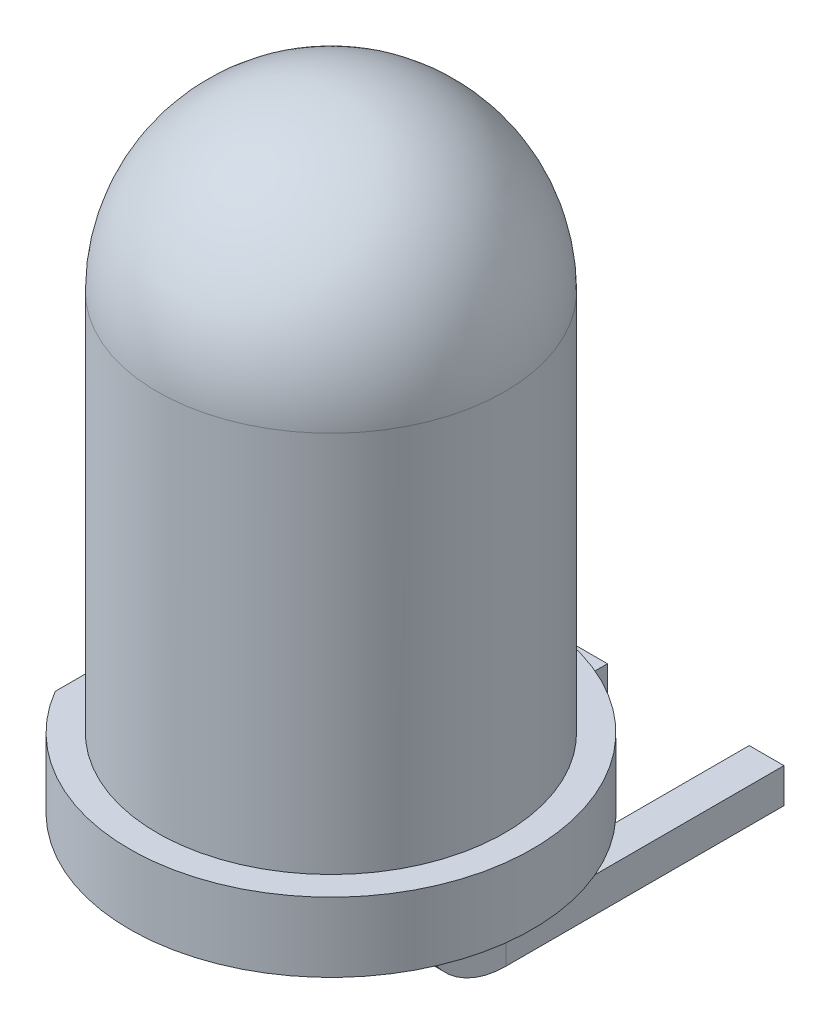
ISO-10303-21;
HEADER;
FILE_DESCRIPTION(('STEP AP214'),'2;1');
FILE_NAME('part.step','',(''),(''),'','','');
FILE_SCHEMA(('AUTOMOTIVE_DESIGN { 1 0 10303 214 1 1 1 1 }'));
ENDSEC;
DATA;
#1=APPLICATION_CONTEXT('core data for automotive mechanical design processes');
#2=APPLICATION_PROTOCOL_DEFINITION('international standard','automotive_design',2000,#1);
#3=PRODUCT_CONTEXT('',#1,'mechanical');
#4=PRODUCT('Part','Part','',(#3));
#5=PRODUCT_RELATED_PRODUCT_CATEGORY('part','',(#4));
#6=PRODUCT_DEFINITION_FORMATION('','',#4);
#7=PRODUCT_DEFINITION_CONTEXT('part definition',#1,'design');
#8=PRODUCT_DEFINITION('design','',#6,#7);
#9=PRODUCT_DEFINITION_SHAPE('','',#8);
#10=(LENGTH_UNIT() NAMED_UNIT(*) SI_UNIT(.MILLI.,.METRE.));
#11=(NAMED_UNIT(*) PLANE_ANGLE_UNIT() SI_UNIT($,.RADIAN.));
#12=(NAMED_UNIT(*) SI_UNIT($,.STERADIAN.) SOLID_ANGLE_UNIT());
#13=UNCERTAINTY_MEASURE_WITH_UNIT(LENGTH_MEASURE(1.E-05),#10,'distance_accuracy_value','');
#14=(GEOMETRIC_REPRESENTATION_CONTEXT(3) GLOBAL_UNCERTAINTY_ASSIGNED_CONTEXT((#13)) GLOBAL_UNIT_ASSIGNED_CONTEXT((#10,
#11,#12)) REPRESENTATION_CONTEXT('',''));
#15=CARTESIAN_POINT('',(0.,0.,0.));
#16=DIRECTION('',(0.,0.,1.));
#17=DIRECTION('',(1.,0.,0.));
#18=AXIS2_PLACEMENT_3D('',#15,#16,#17);
#19=CARTESIAN_POINT('',(2.9,0.,0.));
#20=DIRECTION('',(0.,1.,0.));
#21=DIRECTION('',(0.,0.,1.));
#22=AXIS2_PLACEMENT_3D('',#19,#20,#21);
#23=PLANE('',#22);
#24=DIRECTION('',(0.,0.,1.));
#25=VECTOR('',#24,1.);
#26=CARTESIAN_POINT('',(1.52,0.,-0.25));
#27=LINE('',#26,#25);
#28=CARTESIAN_POINT('',(1.52,0.,-0.25));
#29=VERTEX_POINT('',#28);
#30=CARTESIAN_POINT('',(1.52,0.,0.25));
#31=VERTEX_POINT('',#30);
#32=EDGE_CURVE('E185',#29,#31,#27,.T.);
#33=ORIENTED_EDGE('',*,*,#32,.F.);
#34=DIRECTION('',(1.,0.,0.));
#35=VECTOR('',#34,1.);
#36=CARTESIAN_POINT('',(1.02,0.,-0.25));
#37=LINE('',#36,#35);
#38=CARTESIAN_POINT('',(1.02,0.,-0.25));
#39=VERTEX_POINT('',#38);
#40=EDGE_CURVE('E178',#39,#29,#37,.T.);
#41=ORIENTED_EDGE('',*,*,#40,.F.);
#42=DIRECTION('',(0.,0.,-1.));
#43=VECTOR('',#42,1.);
#44=CARTESIAN_POINT('',(1.02,0.,-0.25));
#45=LINE('',#44,#43);
#46=CARTESIAN_POINT('',(1.02,0.,0.25));
#47=VERTEX_POINT('',#46);
#48=EDGE_CURVE('E165',#47,#39,#45,.T.);
#49=ORIENTED_EDGE('',*,*,#48,.F.);
#50=DIRECTION('',(-1.,0.,0.));
#51=VECTOR('',#50,1.);
#52=CARTESIAN_POINT('',(1.02,0.,0.25));
#53=LINE('',#52,#51);
#54=EDGE_CURVE('E172',#31,#47,#53,.T.);
#55=ORIENTED_EDGE('',*,*,#54,.F.);
#56=EDGE_LOOP('',(#33,#41,#49,#55));
#57=FACE_BOUND('',#56,.T.);
#58=DIRECTION('',(-1.,0.,0.));
#59=VECTOR('',#58,1.);
#60=CARTESIAN_POINT('',(-1.02,0.,0.25));
#61=LINE('',#60,#59);
#62=CARTESIAN_POINT('',(-1.02,0.,0.25));
#63=VERTEX_POINT('',#62);
#64=CARTESIAN_POINT('',(-1.52,0.,0.25));
#65=VERTEX_POINT('',#64);
#66=EDGE_CURVE('E252',#63,#65,#61,.T.);
#67=ORIENTED_EDGE('',*,*,#66,.F.);
#68=DIRECTION('',(0.,0.,1.));
#69=VECTOR('',#68,1.);
#70=CARTESIAN_POINT('',(-1.02,0.,-0.25));
#71=LINE('',#70,#69);
#72=CARTESIAN_POINT('',(-1.02,0.,-0.25));
#73=VERTEX_POINT('',#72);
#74=EDGE_CURVE('E250',#73,#63,#71,.T.);
#75=ORIENTED_EDGE('',*,*,#74,.F.);
#76=DIRECTION('',(1.,0.,0.));
#77=VECTOR('',#76,1.);
#78=CARTESIAN_POINT('',(-1.02,0.,-0.25));
#79=LINE('',#78,#77);
#80=CARTESIAN_POINT('',(-1.52,0.,-0.25));
#81=VERTEX_POINT('',#80);
#82=EDGE_CURVE('E263',#81,#73,#79,.T.);
#83=ORIENTED_EDGE('',*,*,#82,.F.);
#84=DIRECTION('',(0.,0.,-1.));
#85=VECTOR('',#84,1.);
#86=CARTESIAN_POINT('',(-1.52,0.,-0.25));
#87=LINE('',#86,#85);
#88=EDGE_CURVE('E286',#65,#81,#87,.T.);
#89=ORIENTED_EDGE('',*,*,#88,.F.);
#90=EDGE_LOOP('',(#67,#75,#83,#89));
#91=FACE_BOUND('',#90,.T.);
#92=CARTESIAN_POINT('',(0.,0.,0.));
#93=DIRECTION('',(0.,-1.,0.));
#94=DIRECTION('',(0.,0.,-1.));
#95=AXIS2_PLACEMENT_3D('',#92,#93,#94);
#96=CIRCLE('',#95,2.9);
#97=CARTESIAN_POINT('',(-2.5,0.,-1.46969384566991));
#98=VERTEX_POINT('',#97);
#99=CARTESIAN_POINT('',(-2.5,0.,1.46969384566991));
#100=VERTEX_POINT('',#99);
#101=EDGE_CURVE('E11',#98,#100,#96,.T.);
#102=ORIENTED_EDGE('',*,*,#101,.T.);
#103=DIRECTION('',(0.,0.,1.));
#104=VECTOR('',#103,1.);
#105=CARTESIAN_POINT('',(-2.5,0.,-1.46969384566991));
#106=LINE('',#105,#104);
#107=EDGE_CURVE('E324',#98,#100,#106,.T.);
#108=ORIENTED_EDGE('',*,*,#107,.F.);
#109=EDGE_LOOP('',(#102,#108));
#110=FACE_BOUND('',#109,.T.);
#111=ADVANCED_FACE('F37',(#57,#91,#110),#23,.F.);
#112=CARTESIAN_POINT('',(0.,0.,0.));
#113=DIRECTION('',(0.,-1.,0.));
#114=DIRECTION('',(0.,0.,-1.));
#115=AXIS2_PLACEMENT_3D('',#112,#113,#114);
#116=CYLINDRICAL_SURFACE('',#115,2.9);
#117=CARTESIAN_POINT('',(0.,1.,0.));
#118=DIRECTION('',(0.,-1.,0.));
#119=DIRECTION('',(0.,0.,-1.));
#120=AXIS2_PLACEMENT_3D('',#117,#118,#119);
#121=CIRCLE('',#120,2.9);
#122=CARTESIAN_POINT('',(-2.5,1.,-1.46969384566991));
#123=VERTEX_POINT('',#122);
#124=CARTESIAN_POINT('',(-2.5,1.,1.46969384566991));
#125=VERTEX_POINT('',#124);
#126=EDGE_CURVE('E44',#123,#125,#121,.T.);
#127=ORIENTED_EDGE('',*,*,#126,.T.);
#128=DIRECTION('',(0.,-1.,0.));
#129=VECTOR('',#128,1.);
#130=CARTESIAN_POINT('',(-2.5,9.,1.46969384566991));
#131=LINE('',#130,#129);
#132=EDGE_CURVE('E327',#125,#100,#131,.T.);
#133=ORIENTED_EDGE('',*,*,#132,.T.);
#134=ORIENTED_EDGE('',*,*,#101,.F.);
#135=DIRECTION('',(0.,-1.,0.));
#136=VECTOR('',#135,1.);
#137=CARTESIAN_POINT('',(-2.5,9.,-1.46969384566991));
#138=LINE('',#137,#136);
#139=EDGE_CURVE('E326',#123,#98,#138,.T.);
#140=ORIENTED_EDGE('',*,*,#139,.F.);
#141=EDGE_LOOP('',(#127,#133,#134,#140));
#142=FACE_BOUND('',#141,.T.);
#143=ADVANCED_FACE('F344',(#142),#116,.T.);
#144=CARTESIAN_POINT('',(2.5,1.,0.));
#145=DIRECTION('',(0.,-1.,0.));
#146=DIRECTION('',(0.,0.,-1.));
#147=AXIS2_PLACEMENT_3D('',#144,#145,#146);
#148=PLANE('',#147);
#149=ORIENTED_EDGE('',*,*,#126,.F.);
#150=DIRECTION('',(0.,0.,1.));
#151=VECTOR('',#150,1.);
#152=CARTESIAN_POINT('',(-2.5,1.,0.));
#153=LINE('',#152,#151);
#154=CARTESIAN_POINT('',(-2.5,1.,0.));
#155=VERTEX_POINT('',#154);
#156=EDGE_CURVE('E334',#123,#155,#153,.T.);
#157=ORIENTED_EDGE('',*,*,#156,.T.);
#158=CARTESIAN_POINT('',(0.,1.,0.));
#159=DIRECTION('',(0.,-1.,0.));
#160=DIRECTION('',(0.,0.,-1.));
#161=AXIS2_PLACEMENT_3D('',#158,#159,#160);
#162=CIRCLE('',#161,2.5);
#163=EDGE_CURVE('E338',#155,#155,#162,.T.);
#164=ORIENTED_EDGE('',*,*,#163,.T.);
#165=EDGE_CURVE('E330',#155,#125,#153,.T.);
#166=ORIENTED_EDGE('',*,*,#165,.T.);
#167=EDGE_LOOP('',(#149,#157,#164,#166));
#168=FACE_BOUND('',#167,.T.);
#169=ADVANCED_FACE('F348',(#168),#148,.F.);
#170=CARTESIAN_POINT('',(0.,0.,0.));
#171=DIRECTION('',(0.,-1.,0.));
#172=DIRECTION('',(0.,0.,-1.));
#173=AXIS2_PLACEMENT_3D('',#170,#171,#172);
#174=CYLINDRICAL_SURFACE('',#173,2.5);
#175=ORIENTED_EDGE('',*,*,#163,.F.);
#176=EDGE_LOOP('',(#175));
#177=FACE_BOUND('',#176,.T.);
#178=CARTESIAN_POINT('',(0.,6.5,0.));
#179=DIRECTION('',(0.,-1.,0.));
#180=DIRECTION('',(0.,0.,-1.));
#181=AXIS2_PLACEMENT_3D('',#178,#179,#180);
#182=CIRCLE('',#181,2.5);
#183=CARTESIAN_POINT('',(0.,6.5,-2.5));
#184=VERTEX_POINT('',#183);
#185=EDGE_CURVE('E335',#184,#184,#182,.T.);
#186=ORIENTED_EDGE('',*,*,#185,.T.);
#187=EDGE_LOOP('',(#186));
#188=FACE_BOUND('',#187,.T.);
#189=ADVANCED_FACE('F361',(#177,#188),#174,.T.);
#190=CARTESIAN_POINT('',(0.,6.5,0.));
#191=DIRECTION('',(0.,-1.,0.));
#192=DIRECTION('',(1.,0.,0.));
#193=AXIS2_PLACEMENT_3D('',#190,#191,#192);
#194=SPHERICAL_SURFACE('',#193,2.5);
#195=ORIENTED_EDGE('',*,*,#185,.F.);
#196=EDGE_LOOP('',(#195));
#197=FACE_BOUND('',#196,.T.);
#198=ADVANCED_FACE('F366',(#197),#194,.T.);
#199=CARTESIAN_POINT('',(-2.5,9.,-1.46969384566991));
#200=DIRECTION('',(1.,0.,0.));
#201=DIRECTION('',(0.,0.,-1.));
#202=AXIS2_PLACEMENT_3D('',#199,#200,#201);
#203=PLANE('',#202);
#204=ORIENTED_EDGE('',*,*,#139,.T.);
#205=ORIENTED_EDGE('',*,*,#107,.T.);
#206=ORIENTED_EDGE('',*,*,#132,.F.);
#207=ORIENTED_EDGE('',*,*,#165,.F.);
#208=ORIENTED_EDGE('',*,*,#156,.F.);
#209=EDGE_LOOP('',(#204,#205,#206,#207,#208));
#210=FACE_BOUND('',#209,.T.);
#211=ADVANCED_FACE('F351',(#210),#203,.F.);
#212=CARTESIAN_POINT('',(0.,-1.4,-5.));
#213=DIRECTION('',(0.,0.,-1.));
#214=DIRECTION('',(0.,1.,0.));
#215=AXIS2_PLACEMENT_3D('',#212,#213,#214);
#216=PLANE('',#215);
#217=DIRECTION('',(0.,1.,0.));
#218=VECTOR('',#217,1.);
#219=CARTESIAN_POINT('',(-1.52,-1.15,-5.));
#220=LINE('',#219,#218);
#221=CARTESIAN_POINT('',(-1.52,-1.65,-5.));
#222=VERTEX_POINT('',#221);
#223=CARTESIAN_POINT('',(-1.52,-1.15,-5.));
#224=VERTEX_POINT('',#223);
#225=EDGE_CURVE('E303',#222,#224,#220,.T.);
#226=ORIENTED_EDGE('',*,*,#225,.T.);
#227=DIRECTION('',(1.,0.,0.));
#228=VECTOR('',#227,1.);
#229=CARTESIAN_POINT('',(-1.02,-1.15,-5.));
#230=LINE('',#229,#228);
#231=CARTESIAN_POINT('',(-1.02,-1.15,-5.));
#232=VERTEX_POINT('',#231);
#233=EDGE_CURVE('E317',#224,#232,#230,.T.);
#234=ORIENTED_EDGE('',*,*,#233,.T.);
#235=DIRECTION('',(0.,-1.,0.));
#236=VECTOR('',#235,1.);
#237=CARTESIAN_POINT('',(-1.02,-1.15,-5.));
#238=LINE('',#237,#236);
#239=CARTESIAN_POINT('',(-1.02,-1.65,-5.));
#240=VERTEX_POINT('',#239);
#241=EDGE_CURVE('E275',#232,#240,#238,.T.);
#242=ORIENTED_EDGE('',*,*,#241,.T.);
#243=DIRECTION('',(-1.,0.,0.));
#244=VECTOR('',#243,1.);
#245=CARTESIAN_POINT('',(-1.02,-1.65,-5.));
#246=LINE('',#245,#244);
#247=EDGE_CURVE('E281',#240,#222,#246,.T.);
#248=ORIENTED_EDGE('',*,*,#247,.T.);
#249=EDGE_LOOP('',(#226,#234,#242,#248));
#250=FACE_BOUND('',#249,.T.);
#251=ADVANCED_FACE('F373',(#250),#216,.T.);
#252=CARTESIAN_POINT('',(-1.02,0.,-0.25));
#253=DIRECTION('',(1.,0.,0.));
#254=DIRECTION('',(0.,0.,-1.));
#255=AXIS2_PLACEMENT_3D('',#252,#253,#254);
#256=PLANE('',#255);
#257=DIRECTION('',(0.,-1.,0.));
#258=VECTOR('',#257,1.);
#259=CARTESIAN_POINT('',(-1.02,0.,0.25));
#260=LINE('',#259,#258);
#261=CARTESIAN_POINT('',(-1.02,-0.4,0.25));
#262=VERTEX_POINT('',#261);
#263=EDGE_CURVE('E256',#63,#262,#260,.T.);
#264=ORIENTED_EDGE('',*,*,#263,.T.);
#265=DIRECTION('',(0.,0.,1.));
#266=VECTOR('',#265,1.);
#267=CARTESIAN_POINT('',(-1.02,-0.4,-0.25));
#268=LINE('',#267,#266);
#269=CARTESIAN_POINT('',(-1.02,-0.4,-0.25));
#270=VERTEX_POINT('',#269);
#271=EDGE_CURVE('E253',#270,#262,#268,.T.);
#272=ORIENTED_EDGE('',*,*,#271,.F.);
#273=DIRECTION('',(0.,-1.,0.));
#274=VECTOR('',#273,1.);
#275=CARTESIAN_POINT('',(-1.02,0.,-0.25));
#276=LINE('',#275,#274);
#277=EDGE_CURVE('E257',#73,#270,#276,.T.);
#278=ORIENTED_EDGE('',*,*,#277,.F.);
#279=ORIENTED_EDGE('',*,*,#74,.T.);
#280=EDGE_LOOP('',(#264,#272,#278,#279));
#281=FACE_BOUND('',#280,.T.);
#282=ADVANCED_FACE('F377',(#281),#256,.T.);
#283=CARTESIAN_POINT('',(-1.02,0.,0.25));
#284=DIRECTION('',(0.,0.,1.));
#285=DIRECTION('',(1.,0.,0.));
#286=AXIS2_PLACEMENT_3D('',#283,#284,#285);
#287=PLANE('',#286);
#288=DIRECTION('',(0.,-1.,0.));
#289=VECTOR('',#288,1.);
#290=CARTESIAN_POINT('',(-1.52,0.,0.25));
#291=LINE('',#290,#289);
#292=CARTESIAN_POINT('',(-1.52,-0.4,0.25));
#293=VERTEX_POINT('',#292);
#294=EDGE_CURVE('E289',#65,#293,#291,.T.);
#295=ORIENTED_EDGE('',*,*,#294,.T.);
#296=DIRECTION('',(-1.,0.,0.));
#297=VECTOR('',#296,1.);
#298=CARTESIAN_POINT('',(-1.02,-0.4,0.25));
#299=LINE('',#298,#297);
#300=EDGE_CURVE('E260',#262,#293,#299,.T.);
#301=ORIENTED_EDGE('',*,*,#300,.F.);
#302=ORIENTED_EDGE('',*,*,#263,.F.);
#303=ORIENTED_EDGE('',*,*,#66,.T.);
#304=EDGE_LOOP('',(#295,#301,#302,#303));
#305=FACE_BOUND('',#304,.T.);
#306=ADVANCED_FACE('F406',(#305),#287,.T.);
#307=CARTESIAN_POINT('',(-1.52,0.,-0.25));
#308=DIRECTION('',(-1.,0.,0.));
#309=DIRECTION('',(0.,0.,1.));
#310=AXIS2_PLACEMENT_3D('',#307,#308,#309);
#311=PLANE('',#310);
#312=DIRECTION('',(0.,-1.,0.));
#313=VECTOR('',#312,1.);
#314=CARTESIAN_POINT('',(-1.52,0.,-0.25));
#315=LINE('',#314,#313);
#316=CARTESIAN_POINT('',(-1.52,-0.4,-0.25));
#317=VERTEX_POINT('',#316);
#318=EDGE_CURVE('E59',#81,#317,#315,.T.);
#319=ORIENTED_EDGE('',*,*,#318,.T.);
#320=DIRECTION('',(0.,0.,-1.));
#321=VECTOR('',#320,1.);
#322=CARTESIAN_POINT('',(-1.52,-0.4,-0.25));
#323=LINE('',#322,#321);
#324=EDGE_CURVE('E292',#293,#317,#323,.T.);
#325=ORIENTED_EDGE('',*,*,#324,.F.);
#326=ORIENTED_EDGE('',*,*,#294,.F.);
#327=ORIENTED_EDGE('',*,*,#88,.T.);
#328=EDGE_LOOP('',(#319,#325,#326,#327));
#329=FACE_BOUND('',#328,.T.);
#330=ADVANCED_FACE('F395',(#329),#311,.T.);
#331=CARTESIAN_POINT('',(-1.02,0.,-0.25));
#332=DIRECTION('',(0.,0.,-1.));
#333=DIRECTION('',(-1.,0.,0.));
#334=AXIS2_PLACEMENT_3D('',#331,#332,#333);
#335=PLANE('',#334);
#336=DIRECTION('',(1.,0.,0.));
#337=VECTOR('',#336,1.);
#338=CARTESIAN_POINT('',(-1.02,-0.4,-0.25));
#339=LINE('',#338,#337);
#340=EDGE_CURVE('E274',#317,#270,#339,.T.);
#341=ORIENTED_EDGE('',*,*,#340,.F.);
#342=ORIENTED_EDGE('',*,*,#318,.F.);
#343=ORIENTED_EDGE('',*,*,#82,.T.);
#344=ORIENTED_EDGE('',*,*,#277,.T.);
#345=EDGE_LOOP('',(#341,#342,#343,#344));
#346=FACE_BOUND('',#345,.T.);
#347=ADVANCED_FACE('F391',(#346),#335,.T.);
#348=CARTESIAN_POINT('',(-1.02,-0.4,-0.25));
#349=DIRECTION('',(1.,0.,0.));
#350=DIRECTION('',(0.,0.,-1.));
#351=AXIS2_PLACEMENT_3D('',#348,#349,#350);
#352=PLANE('',#351);
#353=CARTESIAN_POINT('',(-1.02,-0.4,-1.));
#354=DIRECTION('',(1.,0.,0.));
#355=DIRECTION('',(0.,0.,1.));
#356=AXIS2_PLACEMENT_3D('',#353,#354,#355);
#357=CIRCLE('',#356,1.25);
#358=CARTESIAN_POINT('',(-1.02,-1.65,-1.));
#359=VERTEX_POINT('',#358);
#360=EDGE_CURVE('E267',#262,#359,#357,.T.);
#361=ORIENTED_EDGE('',*,*,#360,.T.);
#362=DIRECTION('',(0.,-1.,0.));
#363=VECTOR('',#362,1.);
#364=CARTESIAN_POINT('',(-1.02,-1.15,-1.));
#365=LINE('',#364,#363);
#366=CARTESIAN_POINT('',(-1.02,-1.15,-1.));
#367=VERTEX_POINT('',#366);
#368=EDGE_CURVE('E264',#367,#359,#365,.T.);
#369=ORIENTED_EDGE('',*,*,#368,.F.);
#370=CARTESIAN_POINT('',(-1.02,-0.4,-1.));
#371=DIRECTION('',(1.,0.,0.));
#372=DIRECTION('',(0.,0.,1.));
#373=AXIS2_PLACEMENT_3D('',#370,#371,#372);
#374=CIRCLE('',#373,0.75);
#375=EDGE_CURVE('E268',#270,#367,#374,.T.);
#376=ORIENTED_EDGE('',*,*,#375,.F.);
#377=ORIENTED_EDGE('',*,*,#271,.T.);
#378=EDGE_LOOP('',(#361,#369,#376,#377));
#379=FACE_BOUND('',#378,.T.);
#380=ADVANCED_FACE('F394',(#379),#352,.T.);
#381=CARTESIAN_POINT('',(-1.27,-0.4,-1.));
#382=DIRECTION('',(1.,0.,0.));
#383=DIRECTION('',(0.,0.,-1.));
#384=AXIS2_PLACEMENT_3D('',#381,#382,#383);
#385=CYLINDRICAL_SURFACE('',#384,1.25);
#386=CARTESIAN_POINT('',(-1.52,-0.4,-1.));
#387=DIRECTION('',(1.,0.,0.));
#388=DIRECTION('',(0.,0.,1.));
#389=AXIS2_PLACEMENT_3D('',#386,#387,#388);
#390=CIRCLE('',#389,1.25);
#391=CARTESIAN_POINT('',(-1.52,-1.65,-1.));
#392=VERTEX_POINT('',#391);
#393=EDGE_CURVE('E295',#293,#392,#390,.T.);
#394=ORIENTED_EDGE('',*,*,#393,.T.);
#395=DIRECTION('',(-1.,0.,0.));
#396=VECTOR('',#395,1.);
#397=CARTESIAN_POINT('',(-1.02,-1.65,-1.));
#398=LINE('',#397,#396);
#399=EDGE_CURVE('E271',#359,#392,#398,.T.);
#400=ORIENTED_EDGE('',*,*,#399,.F.);
#401=ORIENTED_EDGE('',*,*,#360,.F.);
#402=ORIENTED_EDGE('',*,*,#300,.T.);
#403=EDGE_LOOP('',(#394,#400,#401,#402));
#404=FACE_BOUND('',#403,.T.);
#405=ADVANCED_FACE('F402',(#404),#385,.T.);
#406=CARTESIAN_POINT('',(-1.52,-0.4,-0.25));
#407=DIRECTION('',(-1.,0.,0.));
#408=DIRECTION('',(0.,0.,1.));
#409=AXIS2_PLACEMENT_3D('',#406,#407,#408);
#410=PLANE('',#409);
#411=CARTESIAN_POINT('',(-1.52,-0.4,-1.));
#412=DIRECTION('',(1.,0.,0.));
#413=DIRECTION('',(0.,0.,1.));
#414=AXIS2_PLACEMENT_3D('',#411,#412,#413);
#415=CIRCLE('',#414,0.75);
#416=CARTESIAN_POINT('',(-1.52,-1.15,-1.));
#417=VERTEX_POINT('',#416);
#418=EDGE_CURVE('E310',#317,#417,#415,.T.);
#419=ORIENTED_EDGE('',*,*,#418,.T.);
#420=DIRECTION('',(0.,1.,0.));
#421=VECTOR('',#420,1.);
#422=CARTESIAN_POINT('',(-1.52,-1.15,-1.));
#423=LINE('',#422,#421);
#424=EDGE_CURVE('E298',#392,#417,#423,.T.);
#425=ORIENTED_EDGE('',*,*,#424,.F.);
#426=ORIENTED_EDGE('',*,*,#393,.F.);
#427=ORIENTED_EDGE('',*,*,#324,.T.);
#428=EDGE_LOOP('',(#419,#425,#426,#427));
#429=FACE_BOUND('',#428,.T.);
#430=ADVANCED_FACE('F389',(#429),#410,.T.);
#431=CARTESIAN_POINT('',(-1.27,-0.4,-1.));
#432=DIRECTION('',(1.,0.,0.));
#433=DIRECTION('',(0.,0.,-1.));
#434=AXIS2_PLACEMENT_3D('',#431,#432,#433);
#435=CYLINDRICAL_SURFACE('',#434,0.75);
#436=DIRECTION('',(1.,0.,0.));
#437=VECTOR('',#436,1.);
#438=CARTESIAN_POINT('',(-1.02,-1.15,-1.));
#439=LINE('',#438,#437);
#440=EDGE_CURVE('E284',#417,#367,#439,.T.);
#441=ORIENTED_EDGE('',*,*,#440,.F.);
#442=ORIENTED_EDGE('',*,*,#418,.F.);
#443=ORIENTED_EDGE('',*,*,#340,.T.);
#444=ORIENTED_EDGE('',*,*,#375,.T.);
#445=EDGE_LOOP('',(#441,#442,#443,#444));
#446=FACE_BOUND('',#445,.T.);
#447=ADVANCED_FACE('F385',(#446),#435,.F.);
#448=CARTESIAN_POINT('',(-1.02,-1.15,-1.));
#449=DIRECTION('',(1.,0.,0.));
#450=DIRECTION('',(0.,0.,-1.));
#451=AXIS2_PLACEMENT_3D('',#448,#449,#450);
#452=PLANE('',#451);
#453=DIRECTION('',(0.,0.,-1.));
#454=VECTOR('',#453,1.);
#455=CARTESIAN_POINT('',(-1.02,-1.65,-1.));
#456=LINE('',#455,#454);
#457=EDGE_CURVE('E277',#359,#240,#456,.T.);
#458=ORIENTED_EDGE('',*,*,#457,.T.);
#459=ORIENTED_EDGE('',*,*,#241,.F.);
#460=DIRECTION('',(0.,0.,-1.));
#461=VECTOR('',#460,1.);
#462=CARTESIAN_POINT('',(-1.02,-1.15,-1.));
#463=LINE('',#462,#461);
#464=EDGE_CURVE('E278',#367,#232,#463,.T.);
#465=ORIENTED_EDGE('',*,*,#464,.F.);
#466=ORIENTED_EDGE('',*,*,#368,.T.);
#467=EDGE_LOOP('',(#458,#459,#465,#466));
#468=FACE_BOUND('',#467,.T.);
#469=ADVANCED_FACE('F388',(#468),#452,.T.);
#470=CARTESIAN_POINT('',(-1.02,-1.65,-1.));
#471=DIRECTION('',(0.,-1.,0.));
#472=DIRECTION('',(0.,0.,-1.));
#473=AXIS2_PLACEMENT_3D('',#470,#471,#472);
#474=PLANE('',#473);
#475=DIRECTION('',(0.,0.,-1.));
#476=VECTOR('',#475,1.);
#477=CARTESIAN_POINT('',(-1.52,-1.65,-1.));
#478=LINE('',#477,#476);
#479=EDGE_CURVE('E300',#392,#222,#478,.T.);
#480=ORIENTED_EDGE('',*,*,#479,.T.);
#481=ORIENTED_EDGE('',*,*,#247,.F.);
#482=ORIENTED_EDGE('',*,*,#457,.F.);
#483=ORIENTED_EDGE('',*,*,#399,.T.);
#484=EDGE_LOOP('',(#480,#481,#482,#483));
#485=FACE_BOUND('',#484,.T.);
#486=ADVANCED_FACE('F398',(#485),#474,.T.);
#487=CARTESIAN_POINT('',(-1.52,-1.15,-1.));
#488=DIRECTION('',(-1.,0.,0.));
#489=DIRECTION('',(0.,0.,1.));
#490=AXIS2_PLACEMENT_3D('',#487,#488,#489);
#491=PLANE('',#490);
#492=DIRECTION('',(0.,0.,-1.));
#493=VECTOR('',#492,1.);
#494=CARTESIAN_POINT('',(-1.52,-1.15,-1.));
#495=LINE('',#494,#493);
#496=EDGE_CURVE('E314',#417,#224,#495,.T.);
#497=ORIENTED_EDGE('',*,*,#496,.T.);
#498=ORIENTED_EDGE('',*,*,#225,.F.);
#499=ORIENTED_EDGE('',*,*,#479,.F.);
#500=ORIENTED_EDGE('',*,*,#424,.T.);
#501=EDGE_LOOP('',(#497,#498,#499,#500));
#502=FACE_BOUND('',#501,.T.);
#503=ADVANCED_FACE('F383',(#502),#491,.T.);
#504=CARTESIAN_POINT('',(-1.02,-1.15,-1.));
#505=DIRECTION('',(0.,1.,0.));
#506=DIRECTION('',(0.,0.,1.));
#507=AXIS2_PLACEMENT_3D('',#504,#505,#506);
#508=PLANE('',#507);
#509=ORIENTED_EDGE('',*,*,#233,.F.);
#510=ORIENTED_EDGE('',*,*,#496,.F.);
#511=ORIENTED_EDGE('',*,*,#440,.T.);
#512=ORIENTED_EDGE('',*,*,#464,.T.);
#513=EDGE_LOOP('',(#509,#510,#511,#512));
#514=FACE_BOUND('',#513,.T.);
#515=ADVANCED_FACE('F374',(#514),#508,.T.);
#516=CARTESIAN_POINT('',(0.,-1.4,-5.));
#517=DIRECTION('',(0.,0.,-1.));
#518=DIRECTION('',(0.,1.,0.));
#519=AXIS2_PLACEMENT_3D('',#516,#517,#518);
#520=PLANE('',#519);
#521=DIRECTION('',(1.,0.,0.));
#522=VECTOR('',#521,1.);
#523=CARTESIAN_POINT('',(1.02,-1.15,-5.));
#524=LINE('',#523,#522);
#525=CARTESIAN_POINT('',(1.02,-1.15,-5.));
#526=VERTEX_POINT('',#525);
#527=CARTESIAN_POINT('',(1.52,-1.15,-5.));
#528=VERTEX_POINT('',#527);
#529=EDGE_CURVE('E204',#526,#528,#524,.T.);
#530=ORIENTED_EDGE('',*,*,#529,.T.);
#531=DIRECTION('',(0.,-1.,0.));
#532=VECTOR('',#531,1.);
#533=CARTESIAN_POINT('',(1.52,-1.15,-5.));
#534=LINE('',#533,#532);
#535=CARTESIAN_POINT('',(1.52,-1.65,-5.));
#536=VERTEX_POINT('',#535);
#537=EDGE_CURVE('E210',#528,#536,#534,.T.);
#538=ORIENTED_EDGE('',*,*,#537,.T.);
#539=DIRECTION('',(-1.,0.,0.));
#540=VECTOR('',#539,1.);
#541=CARTESIAN_POINT('',(1.02,-1.65,-5.));
#542=LINE('',#541,#540);
#543=CARTESIAN_POINT('',(1.02,-1.65,-5.));
#544=VERTEX_POINT('',#543);
#545=EDGE_CURVE('E230',#536,#544,#542,.T.);
#546=ORIENTED_EDGE('',*,*,#545,.T.);
#547=DIRECTION('',(0.,1.,0.));
#548=VECTOR('',#547,1.);
#549=CARTESIAN_POINT('',(1.02,-1.15,-5.));
#550=LINE('',#549,#548);
#551=EDGE_CURVE('E243',#544,#526,#550,.T.);
#552=ORIENTED_EDGE('',*,*,#551,.T.);
#553=EDGE_LOOP('',(#530,#538,#546,#552));
#554=FACE_BOUND('',#553,.T.);
#555=ADVANCED_FACE('F382',(#554),#520,.T.);
#556=CARTESIAN_POINT('',(1.02,0.,-0.25));
#557=DIRECTION('',(0.,0.,-1.));
#558=DIRECTION('',(-1.,0.,0.));
#559=AXIS2_PLACEMENT_3D('',#556,#557,#558);
#560=PLANE('',#559);
#561=DIRECTION('',(0.,-1.,0.));
#562=VECTOR('',#561,1.);
#563=CARTESIAN_POINT('',(1.52,0.,-0.25));
#564=LINE('',#563,#562);
#565=CARTESIAN_POINT('',(1.52,-0.4,-0.25));
#566=VERTEX_POINT('',#565);
#567=EDGE_CURVE('E190',#29,#566,#564,.T.);
#568=ORIENTED_EDGE('',*,*,#567,.T.);
#569=DIRECTION('',(1.,0.,0.));
#570=VECTOR('',#569,1.);
#571=CARTESIAN_POINT('',(1.02,-0.4,-0.25));
#572=LINE('',#571,#570);
#573=CARTESIAN_POINT('',(1.02,-0.4,-0.25));
#574=VERTEX_POINT('',#573);
#575=EDGE_CURVE('E181',#574,#566,#572,.T.);
#576=ORIENTED_EDGE('',*,*,#575,.F.);
#577=DIRECTION('',(0.,-1.,0.));
#578=VECTOR('',#577,1.);
#579=CARTESIAN_POINT('',(1.02,0.,-0.25));
#580=LINE('',#579,#578);
#581=EDGE_CURVE('E168',#39,#574,#580,.T.);
#582=ORIENTED_EDGE('',*,*,#581,.F.);
#583=ORIENTED_EDGE('',*,*,#40,.T.);
#584=EDGE_LOOP('',(#568,#576,#582,#583));
#585=FACE_BOUND('',#584,.T.);
#586=ADVANCED_FACE('F177',(#585),#560,.T.);
#587=CARTESIAN_POINT('',(1.52,0.,-0.25));
#588=DIRECTION('',(1.,0.,0.));
#589=DIRECTION('',(0.,0.,-1.));
#590=AXIS2_PLACEMENT_3D('',#587,#588,#589);
#591=PLANE('',#590);
#592=DIRECTION('',(0.,-1.,0.));
#593=VECTOR('',#592,1.);
#594=CARTESIAN_POINT('',(1.52,0.,0.25));
#595=LINE('',#594,#593);
#596=CARTESIAN_POINT('',(1.52,-0.4,0.25));
#597=VERTEX_POINT('',#596);
#598=EDGE_CURVE('E216',#31,#597,#595,.T.);
#599=ORIENTED_EDGE('',*,*,#598,.T.);
#600=DIRECTION('',(0.,0.,1.));
#601=VECTOR('',#600,1.);
#602=CARTESIAN_POINT('',(1.52,-0.4,-0.25));
#603=LINE('',#602,#601);
#604=EDGE_CURVE('E191',#566,#597,#603,.T.);
#605=ORIENTED_EDGE('',*,*,#604,.F.);
#606=ORIENTED_EDGE('',*,*,#567,.F.);
#607=ORIENTED_EDGE('',*,*,#32,.T.);
#608=EDGE_LOOP('',(#599,#605,#606,#607));
#609=FACE_BOUND('',#608,.T.);
#610=ADVANCED_FACE('F453',(#609),#591,.T.);
#611=CARTESIAN_POINT('',(1.02,0.,0.25));
#612=DIRECTION('',(0.,0.,1.));
#613=DIRECTION('',(1.,0.,0.));
#614=AXIS2_PLACEMENT_3D('',#611,#612,#613);
#615=PLANE('',#614);
#616=DIRECTION('',(0.,-1.,0.));
#617=VECTOR('',#616,1.);
#618=CARTESIAN_POINT('',(1.02,0.,0.25));
#619=LINE('',#618,#617);
#620=CARTESIAN_POINT('',(1.02,-0.4,0.25));
#621=VERTEX_POINT('',#620);
#622=EDGE_CURVE('E51',#47,#621,#619,.T.);
#623=ORIENTED_EDGE('',*,*,#622,.T.);
#624=DIRECTION('',(-1.,0.,0.));
#625=VECTOR('',#624,1.);
#626=CARTESIAN_POINT('',(1.02,-0.4,0.25));
#627=LINE('',#626,#625);
#628=EDGE_CURVE('E219',#597,#621,#627,.T.);
#629=ORIENTED_EDGE('',*,*,#628,.F.);
#630=ORIENTED_EDGE('',*,*,#598,.F.);
#631=ORIENTED_EDGE('',*,*,#54,.T.);
#632=EDGE_LOOP('',(#623,#629,#630,#631));
#633=FACE_BOUND('',#632,.T.);
#634=ADVANCED_FACE('F442',(#633),#615,.T.);
#635=CARTESIAN_POINT('',(1.02,0.,-0.25));
#636=DIRECTION('',(-1.,0.,0.));
#637=DIRECTION('',(0.,0.,1.));
#638=AXIS2_PLACEMENT_3D('',#635,#636,#637);
#639=PLANE('',#638);
#640=DIRECTION('',(0.,0.,-1.));
#641=VECTOR('',#640,1.);
#642=CARTESIAN_POINT('',(1.02,-0.4,-0.25));
#643=LINE('',#642,#641);
#644=EDGE_CURVE('E203',#621,#574,#643,.T.);
#645=ORIENTED_EDGE('',*,*,#644,.F.);
#646=ORIENTED_EDGE('',*,*,#622,.F.);
#647=ORIENTED_EDGE('',*,*,#48,.T.);
#648=ORIENTED_EDGE('',*,*,#581,.T.);
#649=EDGE_LOOP('',(#645,#646,#647,#648));
#650=FACE_BOUND('',#649,.T.);
#651=ADVANCED_FACE('F167',(#650),#639,.T.);
#652=CARTESIAN_POINT('',(-1.27,-0.4,-1.));
#653=DIRECTION('',(1.,0.,0.));
#654=DIRECTION('',(0.,0.,-1.));
#655=AXIS2_PLACEMENT_3D('',#652,#653,#654);
#656=CYLINDRICAL_SURFACE('',#655,0.75);
#657=CARTESIAN_POINT('',(1.52,-0.4,-1.));
#658=DIRECTION('',(1.,0.,0.));
#659=DIRECTION('',(0.,0.,1.));
#660=AXIS2_PLACEMENT_3D('',#657,#658,#659);
#661=CIRCLE('',#660,0.75);
#662=CARTESIAN_POINT('',(1.52,-1.15,-1.));
#663=VERTEX_POINT('',#662);
#664=EDGE_CURVE('E196',#566,#663,#661,.T.);
#665=ORIENTED_EDGE('',*,*,#664,.T.);
#666=DIRECTION('',(1.,0.,0.));
#667=VECTOR('',#666,1.);
#668=CARTESIAN_POINT('',(1.02,-1.15,-1.));
#669=LINE('',#668,#667);
#670=CARTESIAN_POINT('',(1.02,-1.15,-1.));
#671=VERTEX_POINT('',#670);
#672=EDGE_CURVE('E193',#671,#663,#669,.T.);
#673=ORIENTED_EDGE('',*,*,#672,.F.);
#674=CARTESIAN_POINT('',(1.02,-0.4,-1.));
#675=DIRECTION('',(1.,0.,0.));
#676=DIRECTION('',(0.,0.,1.));
#677=AXIS2_PLACEMENT_3D('',#674,#675,#676);
#678=CIRCLE('',#677,0.75);
#679=EDGE_CURVE('E197',#574,#671,#678,.T.);
#680=ORIENTED_EDGE('',*,*,#679,.F.);
#681=ORIENTED_EDGE('',*,*,#575,.T.);
#682=EDGE_LOOP('',(#665,#673,#680,#681));
#683=FACE_BOUND('',#682,.T.);
#684=ADVANCED_FACE('F441',(#683),#656,.F.);
#685=CARTESIAN_POINT('',(1.52,-0.4,-0.25));
#686=DIRECTION('',(1.,0.,0.));
#687=DIRECTION('',(0.,0.,-1.));
#688=AXIS2_PLACEMENT_3D('',#685,#686,#687);
#689=PLANE('',#688);
#690=CARTESIAN_POINT('',(1.52,-0.4,-1.));
#691=DIRECTION('',(1.,0.,0.));
#692=DIRECTION('',(0.,0.,1.));
#693=AXIS2_PLACEMENT_3D('',#690,#691,#692);
#694=CIRCLE('',#693,1.25);
#695=CARTESIAN_POINT('',(1.52,-1.65,-1.));
#696=VERTEX_POINT('',#695);
#697=EDGE_CURVE('E222',#597,#696,#694,.T.);
#698=ORIENTED_EDGE('',*,*,#697,.T.);
#699=DIRECTION('',(0.,-1.,0.));
#700=VECTOR('',#699,1.);
#701=CARTESIAN_POINT('',(1.52,-1.15,-1.));
#702=LINE('',#701,#700);
#703=EDGE_CURVE('E200',#663,#696,#702,.T.);
#704=ORIENTED_EDGE('',*,*,#703,.F.);
#705=ORIENTED_EDGE('',*,*,#664,.F.);
#706=ORIENTED_EDGE('',*,*,#604,.T.);
#707=EDGE_LOOP('',(#698,#704,#705,#706));
#708=FACE_BOUND('',#707,.T.);
#709=ADVANCED_FACE('F449',(#708),#689,.T.);
#710=CARTESIAN_POINT('',(-1.27,-0.4,-1.));
#711=DIRECTION('',(1.,0.,0.));
#712=DIRECTION('',(0.,0.,-1.));
#713=AXIS2_PLACEMENT_3D('',#710,#711,#712);
#714=CYLINDRICAL_SURFACE('',#713,1.25);
#715=CARTESIAN_POINT('',(1.02,-0.4,-1.));
#716=DIRECTION('',(1.,0.,0.));
#717=DIRECTION('',(0.,0.,1.));
#718=AXIS2_PLACEMENT_3D('',#715,#716,#717);
#719=CIRCLE('',#718,1.25);
#720=CARTESIAN_POINT('',(1.02,-1.65,-1.));
#721=VERTEX_POINT('',#720);
#722=EDGE_CURVE('E237',#621,#721,#719,.T.);
#723=ORIENTED_EDGE('',*,*,#722,.T.);
#724=DIRECTION('',(-1.,0.,0.));
#725=VECTOR('',#724,1.);
#726=CARTESIAN_POINT('',(1.02,-1.65,-1.));
#727=LINE('',#726,#725);
#728=EDGE_CURVE('E225',#696,#721,#727,.T.);
#729=ORIENTED_EDGE('',*,*,#728,.F.);
#730=ORIENTED_EDGE('',*,*,#697,.F.);
#731=ORIENTED_EDGE('',*,*,#628,.T.);
#732=EDGE_LOOP('',(#723,#729,#730,#731));
#733=FACE_BOUND('',#732,.T.);
#734=ADVANCED_FACE('F437',(#733),#714,.T.);
#735=CARTESIAN_POINT('',(1.02,-0.4,-0.25));
#736=DIRECTION('',(-1.,0.,0.));
#737=DIRECTION('',(0.,0.,1.));
#738=AXIS2_PLACEMENT_3D('',#735,#736,#737);
#739=PLANE('',#738);
#740=DIRECTION('',(0.,1.,0.));
#741=VECTOR('',#740,1.);
#742=CARTESIAN_POINT('',(1.02,-1.15,-1.));
#743=LINE('',#742,#741);
#744=EDGE_CURVE('E212',#721,#671,#743,.T.);
#745=ORIENTED_EDGE('',*,*,#744,.F.);
#746=ORIENTED_EDGE('',*,*,#722,.F.);
#747=ORIENTED_EDGE('',*,*,#644,.T.);
#748=ORIENTED_EDGE('',*,*,#679,.T.);
#749=EDGE_LOOP('',(#745,#746,#747,#748));
#750=FACE_BOUND('',#749,.T.);
#751=ADVANCED_FACE('F433',(#750),#739,.T.);
#752=CARTESIAN_POINT('',(1.02,-1.15,-1.));
#753=DIRECTION('',(0.,1.,0.));
#754=DIRECTION('',(-1.,0.,0.));
#755=AXIS2_PLACEMENT_3D('',#752,#753,#754);
#756=PLANE('',#755);
#757=DIRECTION('',(0.,0.,-1.));
#758=VECTOR('',#757,1.);
#759=CARTESIAN_POINT('',(1.52,-1.15,-1.));
#760=LINE('',#759,#758);
#761=EDGE_CURVE('E206',#663,#528,#760,.T.);
#762=ORIENTED_EDGE('',*,*,#761,.T.);
#763=ORIENTED_EDGE('',*,*,#529,.F.);
#764=DIRECTION('',(0.,0.,-1.));
#765=VECTOR('',#764,1.);
#766=CARTESIAN_POINT('',(1.02,-1.15,-1.));
#767=LINE('',#766,#765);
#768=EDGE_CURVE('E207',#671,#526,#767,.T.);
#769=ORIENTED_EDGE('',*,*,#768,.F.);
#770=ORIENTED_EDGE('',*,*,#672,.T.);
#771=EDGE_LOOP('',(#762,#763,#769,#770));
#772=FACE_BOUND('',#771,.T.);
#773=ADVANCED_FACE('F436',(#772),#756,.T.);
#774=CARTESIAN_POINT('',(1.52,-1.15,-1.));
#775=DIRECTION('',(1.,0.,0.));
#776=DIRECTION('',(0.,0.,-1.));
#777=AXIS2_PLACEMENT_3D('',#774,#775,#776);
#778=PLANE('',#777);
#779=DIRECTION('',(0.,0.,-1.));
#780=VECTOR('',#779,1.);
#781=CARTESIAN_POINT('',(1.52,-1.65,-1.));
#782=LINE('',#781,#780);
#783=EDGE_CURVE('E227',#696,#536,#782,.T.);
#784=ORIENTED_EDGE('',*,*,#783,.T.);
#785=ORIENTED_EDGE('',*,*,#537,.F.);
#786=ORIENTED_EDGE('',*,*,#761,.F.);
#787=ORIENTED_EDGE('',*,*,#703,.T.);
#788=EDGE_LOOP('',(#784,#785,#786,#787));
#789=FACE_BOUND('',#788,.T.);
#790=ADVANCED_FACE('F445',(#789),#778,.T.);
#791=CARTESIAN_POINT('',(1.02,-1.65,-1.));
#792=DIRECTION('',(0.,-1.,0.));
#793=DIRECTION('',(1.,0.,0.));
#794=AXIS2_PLACEMENT_3D('',#791,#792,#793);
#795=PLANE('',#794);
#796=DIRECTION('',(0.,0.,-1.));
#797=VECTOR('',#796,1.);
#798=CARTESIAN_POINT('',(1.02,-1.65,-1.));
#799=LINE('',#798,#797);
#800=EDGE_CURVE('E241',#721,#544,#799,.T.);
#801=ORIENTED_EDGE('',*,*,#800,.T.);
#802=ORIENTED_EDGE('',*,*,#545,.F.);
#803=ORIENTED_EDGE('',*,*,#783,.F.);
#804=ORIENTED_EDGE('',*,*,#728,.T.);
#805=EDGE_LOOP('',(#801,#802,#803,#804));
#806=FACE_BOUND('',#805,.T.);
#807=ADVANCED_FACE('F431',(#806),#795,.T.);
#808=CARTESIAN_POINT('',(1.02,-1.15,-1.));
#809=DIRECTION('',(-1.,0.,0.));
#810=DIRECTION('',(0.,0.,1.));
#811=AXIS2_PLACEMENT_3D('',#808,#809,#810);
#812=PLANE('',#811);
#813=ORIENTED_EDGE('',*,*,#551,.F.);
#814=ORIENTED_EDGE('',*,*,#800,.F.);
#815=ORIENTED_EDGE('',*,*,#744,.T.);
#816=ORIENTED_EDGE('',*,*,#768,.T.);
#817=EDGE_LOOP('',(#813,#814,#815,#816));
#818=FACE_BOUND('',#817,.T.);
#819=ADVANCED_FACE('F379',(#818),#812,.T.);
#820=CLOSED_SHELL('',(#111,#143,#169,#189,#198,#211,#251,#282,#306,#330,#347,#380,#405,#430,
#447,#469,#486,#503,#515,#555,#586,#610,#634,#651,#684,#709,#734,#751,#773,#790,#807,#819));
#821=MANIFOLD_SOLID_BREP('B2',#820);
#822=ADVANCED_BREP_SHAPE_REPRESENTATION('',(#18,#821),#14);
#823=SHAPE_DEFINITION_REPRESENTATION(#9,#822);
ENDSEC;
END-ISO-10303-21;
